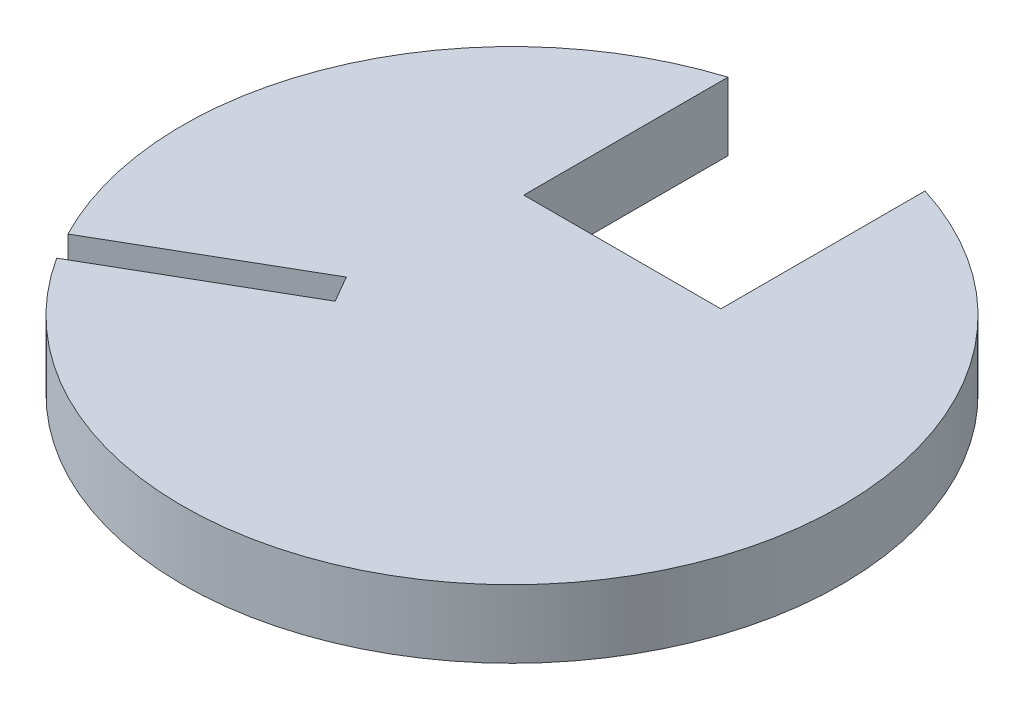
ISO-10303-21;
HEADER;
FILE_DESCRIPTION(('STEP AP214'),'2;1');
FILE_NAME('part.step','',(''),(''),'','','');
FILE_SCHEMA(('AUTOMOTIVE_DESIGN { 1 0 10303 214 1 1 1 1 }'));
ENDSEC;
DATA;
#1=APPLICATION_CONTEXT('core data for automotive mechanical design processes');
#2=APPLICATION_PROTOCOL_DEFINITION('international standard','automotive_design',2000,#1);
#3=PRODUCT_CONTEXT('',#1,'mechanical');
#4=PRODUCT('Part','Part','',(#3));
#5=PRODUCT_RELATED_PRODUCT_CATEGORY('part','',(#4));
#6=PRODUCT_DEFINITION_FORMATION('','',#4);
#7=PRODUCT_DEFINITION_CONTEXT('part definition',#1,'design');
#8=PRODUCT_DEFINITION('design','',#6,#7);
#9=PRODUCT_DEFINITION_SHAPE('','',#8);
#10=(LENGTH_UNIT() NAMED_UNIT(*) SI_UNIT(.MILLI.,.METRE.));
#11=(NAMED_UNIT(*) PLANE_ANGLE_UNIT() SI_UNIT($,.RADIAN.));
#12=(NAMED_UNIT(*) SI_UNIT($,.STERADIAN.) SOLID_ANGLE_UNIT());
#13=UNCERTAINTY_MEASURE_WITH_UNIT(LENGTH_MEASURE(1.E-05),#10,'distance_accuracy_value','');
#14=(GEOMETRIC_REPRESENTATION_CONTEXT(3) GLOBAL_UNCERTAINTY_ASSIGNED_CONTEXT((#13)) GLOBAL_UNIT_ASSIGNED_CONTEXT((#10,
#11,#12)) REPRESENTATION_CONTEXT('',''));
#15=CARTESIAN_POINT('',(0.,0.,0.));
#16=DIRECTION('',(0.,0.,1.));
#17=DIRECTION('',(1.,0.,0.));
#18=AXIS2_PLACEMENT_3D('',#15,#16,#17);
#19=CARTESIAN_POINT('',(0.,1.,3.35031229269065));
#20=DIRECTION('',(0.,-1.,0.));
#21=DIRECTION('',(0.,0.,-1.));
#22=AXIS2_PLACEMENT_3D('',#19,#20,#21);
#23=CYLINDRICAL_SURFACE('',#22,4.84174988325381);
#24=CARTESIAN_POINT('',(0.,1.,3.35031229269065));
#25=DIRECTION('',(0.,1.,0.));
#26=DIRECTION('',(0.,0.,1.));
#27=AXIS2_PLACEMENT_3D('',#24,#25,#26);
#28=CIRCLE('',#27,4.84174988325381);
#29=CARTESIAN_POINT('',(-4.07604839998194,1.,5.9634275547855));
#30=VERTEX_POINT('',#29);
#31=CARTESIAN_POINT('',(1.4475,1.,-1.27));
#32=VERTEX_POINT('',#31);
#33=EDGE_CURVE('E93',#30,#32,#28,.T.);
#34=ORIENTED_EDGE('',*,*,#33,.F.);
#35=DIRECTION('',(0.,-1.,0.));
#36=VECTOR('',#35,1.);
#37=CARTESIAN_POINT('',(-4.07604839998194,1.,5.9634275547855));
#38=LINE('',#37,#36);
#39=CARTESIAN_POINT('',(-4.07604839998194,0.,5.9634275547855));
#40=VERTEX_POINT('',#39);
#41=EDGE_CURVE('E118',#30,#40,#38,.T.);
#42=ORIENTED_EDGE('',*,*,#41,.T.);
#43=CARTESIAN_POINT('',(0.,0.,3.35031229269065));
#44=DIRECTION('',(0.,1.,0.));
#45=DIRECTION('',(0.,0.,1.));
#46=AXIS2_PLACEMENT_3D('',#43,#44,#45);
#47=CIRCLE('',#46,4.84174988325381);
#48=CARTESIAN_POINT('',(1.4475,0.,-1.27));
#49=VERTEX_POINT('',#48);
#50=EDGE_CURVE('E143',#40,#49,#47,.T.);
#51=ORIENTED_EDGE('',*,*,#50,.T.);
#52=DIRECTION('',(0.,-1.,0.));
#53=VECTOR('',#52,1.);
#54=CARTESIAN_POINT('',(1.4475,1.,-1.27));
#55=LINE('',#54,#53);
#56=EDGE_CURVE('E50',#32,#49,#55,.T.);
#57=ORIENTED_EDGE('',*,*,#56,.F.);
#58=EDGE_LOOP('',(#34,#42,#51,#57));
#59=FACE_BOUND('',#58,.T.);
#60=ADVANCED_FACE('F39',(#59),#23,.T.);
#61=CARTESIAN_POINT('',(-1.4475,0.,-1.27));
#62=VERTEX_POINT('',#61);
#63=CARTESIAN_POINT('',(-4.30104839998194,0.,5.5737161230825));
#64=VERTEX_POINT('',#63);
#65=EDGE_CURVE('E147',#62,#64,#47,.T.);
#66=ORIENTED_EDGE('',*,*,#65,.T.);
#67=DIRECTION('',(0.,-1.,0.));
#68=VECTOR('',#67,1.);
#69=CARTESIAN_POINT('',(-4.30104839998194,1.,5.5737161230825));
#70=LINE('',#69,#68);
#71=CARTESIAN_POINT('',(-4.30104839998194,1.,5.5737161230825));
#72=VERTEX_POINT('',#71);
#73=EDGE_CURVE('E140',#64,#72,#70,.F.);
#74=ORIENTED_EDGE('',*,*,#73,.T.);
#75=CARTESIAN_POINT('',(-1.4475,1.,-1.27));
#76=VERTEX_POINT('',#75);
#77=EDGE_CURVE('E142',#76,#72,#28,.T.);
#78=ORIENTED_EDGE('',*,*,#77,.F.);
#79=DIRECTION('',(0.,-1.,0.));
#80=VECTOR('',#79,1.);
#81=CARTESIAN_POINT('',(-1.4475,1.,-1.27));
#82=LINE('',#81,#80);
#83=EDGE_CURVE('E149',#76,#62,#82,.T.);
#84=ORIENTED_EDGE('',*,*,#83,.T.);
#85=EDGE_LOOP('',(#66,#74,#78,#84));
#86=FACE_BOUND('',#85,.T.);
#87=ADVANCED_FACE('F41',(#86),#23,.T.);
#88=CARTESIAN_POINT('',(1.4475,1.,1.73));
#89=DIRECTION('',(1.,0.,0.));
#90=DIRECTION('',(0.,0.,-1.));
#91=AXIS2_PLACEMENT_3D('',#88,#89,#90);
#92=PLANE('',#91);
#93=DIRECTION('',(0.,0.,1.));
#94=VECTOR('',#93,1.);
#95=CARTESIAN_POINT('',(1.4475,0.,1.73));
#96=LINE('',#95,#94);
#97=CARTESIAN_POINT('',(1.4475,0.,1.73));
#98=VERTEX_POINT('',#97);
#99=EDGE_CURVE('E153',#49,#98,#96,.T.);
#100=ORIENTED_EDGE('',*,*,#99,.T.);
#101=DIRECTION('',(0.,-1.,0.));
#102=VECTOR('',#101,1.);
#103=CARTESIAN_POINT('',(1.4475,1.,1.73));
#104=LINE('',#103,#102);
#105=CARTESIAN_POINT('',(1.4475,1.,1.73));
#106=VERTEX_POINT('',#105);
#107=EDGE_CURVE('E161',#106,#98,#104,.T.);
#108=ORIENTED_EDGE('',*,*,#107,.F.);
#109=DIRECTION('',(0.,0.,1.));
#110=VECTOR('',#109,1.);
#111=CARTESIAN_POINT('',(1.4475,1.,1.73));
#112=LINE('',#111,#110);
#113=EDGE_CURVE('E145',#32,#106,#112,.T.);
#114=ORIENTED_EDGE('',*,*,#113,.F.);
#115=ORIENTED_EDGE('',*,*,#56,.T.);
#116=EDGE_LOOP('',(#100,#108,#114,#115));
#117=FACE_BOUND('',#116,.T.);
#118=ADVANCED_FACE('F167',(#117),#92,.F.);
#119=CARTESIAN_POINT('',(-1.4475,1.,1.73));
#120=DIRECTION('',(0.,0.,1.));
#121=DIRECTION('',(1.,0.,0.));
#122=AXIS2_PLACEMENT_3D('',#119,#120,#121);
#123=PLANE('',#122);
#124=DIRECTION('',(-1.,0.,0.));
#125=VECTOR('',#124,1.);
#126=CARTESIAN_POINT('',(-1.4475,0.,1.73));
#127=LINE('',#126,#125);
#128=CARTESIAN_POINT('',(-1.4475,0.,1.73));
#129=VERTEX_POINT('',#128);
#130=EDGE_CURVE('E154',#98,#129,#127,.T.);
#131=ORIENTED_EDGE('',*,*,#130,.T.);
#132=DIRECTION('',(0.,-1.,0.));
#133=VECTOR('',#132,1.);
#134=CARTESIAN_POINT('',(-1.4475,1.,1.73));
#135=LINE('',#134,#133);
#136=CARTESIAN_POINT('',(-1.4475,1.,1.73));
#137=VERTEX_POINT('',#136);
#138=EDGE_CURVE('E157',#137,#129,#135,.T.);
#139=ORIENTED_EDGE('',*,*,#138,.F.);
#140=DIRECTION('',(-1.,0.,0.));
#141=VECTOR('',#140,1.);
#142=CARTESIAN_POINT('',(-1.4475,1.,1.73));
#143=LINE('',#142,#141);
#144=EDGE_CURVE('E148',#106,#137,#143,.T.);
#145=ORIENTED_EDGE('',*,*,#144,.F.);
#146=ORIENTED_EDGE('',*,*,#107,.T.);
#147=EDGE_LOOP('',(#131,#139,#145,#146));
#148=FACE_BOUND('',#147,.T.);
#149=ADVANCED_FACE('F180',(#148),#123,.F.);
#150=CARTESIAN_POINT('',(-1.4475,1.,1.73));
#151=DIRECTION('',(-1.,0.,0.));
#152=DIRECTION('',(0.,0.,1.));
#153=AXIS2_PLACEMENT_3D('',#150,#151,#152);
#154=PLANE('',#153);
#155=DIRECTION('',(0.,0.,-1.));
#156=VECTOR('',#155,1.);
#157=CARTESIAN_POINT('',(-1.4475,0.,1.73));
#158=LINE('',#157,#156);
#159=EDGE_CURVE('E82',#129,#62,#158,.T.);
#160=ORIENTED_EDGE('',*,*,#159,.T.);
#161=ORIENTED_EDGE('',*,*,#83,.F.);
#162=DIRECTION('',(0.,0.,-1.));
#163=VECTOR('',#162,1.);
#164=CARTESIAN_POINT('',(-1.4475,1.,1.73));
#165=LINE('',#164,#163);
#166=EDGE_CURVE('E65',#137,#76,#165,.T.);
#167=ORIENTED_EDGE('',*,*,#166,.F.);
#168=ORIENTED_EDGE('',*,*,#138,.T.);
#169=EDGE_LOOP('',(#160,#161,#167,#168));
#170=FACE_BOUND('',#169,.T.);
#171=ADVANCED_FACE('F177',(#170),#154,.F.);
#172=CARTESIAN_POINT('',(0.,1.,3.35031229269065));
#173=DIRECTION('',(0.,1.,0.));
#174=DIRECTION('',(0.,0.,1.));
#175=AXIS2_PLACEMENT_3D('',#172,#173,#174);
#176=PLANE('',#175);
#177=DIRECTION('',(0.866025403784439,0.,-0.5));
#178=VECTOR('',#177,1.);
#179=CARTESIAN_POINT('',(-4.08057839766815,1.,5.96604295016906));
#180=LINE('',#179,#178);
#181=CARTESIAN_POINT('',(-1.48250218631483,1.,4.46604295016906));
#182=VERTEX_POINT('',#181);
#183=EDGE_CURVE('E114',#30,#182,#180,.T.);
#184=ORIENTED_EDGE('',*,*,#183,.F.);
#185=ORIENTED_EDGE('',*,*,#33,.T.);
#186=ORIENTED_EDGE('',*,*,#113,.T.);
#187=ORIENTED_EDGE('',*,*,#144,.T.);
#188=ORIENTED_EDGE('',*,*,#166,.T.);
#189=ORIENTED_EDGE('',*,*,#77,.T.);
#190=DIRECTION('',(-0.866025403784439,0.,0.5));
#191=VECTOR('',#190,1.);
#192=CARTESIAN_POINT('',(-4.30557839766815,1.,5.57633151846606));
#193=LINE('',#192,#191);
#194=CARTESIAN_POINT('',(-1.70750218631483,1.,4.07633151846606));
#195=VERTEX_POINT('',#194);
#196=EDGE_CURVE('E130',#195,#72,#193,.T.);
#197=ORIENTED_EDGE('',*,*,#196,.F.);
#198=DIRECTION('',(-0.5,0.,-0.866025403784439));
#199=VECTOR('',#198,1.);
#200=CARTESIAN_POINT('',(-1.48250218631483,1.,4.46604295016906));
#201=LINE('',#200,#199);
#202=EDGE_CURVE('E121',#182,#195,#201,.T.);
#203=ORIENTED_EDGE('',*,*,#202,.F.);
#204=EDGE_LOOP('',(#184,#185,#186,#187,#188,#189,#197,#203));
#205=FACE_BOUND('',#204,.T.);
#206=ADVANCED_FACE('F129',(#205),#176,.T.);
#207=CARTESIAN_POINT('',(0.,0.,3.35031229269065));
#208=DIRECTION('',(0.,1.,0.));
#209=DIRECTION('',(0.,0.,1.));
#210=AXIS2_PLACEMENT_3D('',#207,#208,#209);
#211=PLANE('',#210);
#212=ORIENTED_EDGE('',*,*,#50,.F.);
#213=DIRECTION('',(-0.866025403784439,0.,0.5));
#214=VECTOR('',#213,1.);
#215=CARTESIAN_POINT('',(-4.08057839766815,0.,5.96604295016906));
#216=LINE('',#215,#214);
#217=CARTESIAN_POINT('',(-1.48250218631483,0.,4.46604295016906));
#218=VERTEX_POINT('',#217);
#219=EDGE_CURVE('E133',#218,#40,#216,.T.);
#220=ORIENTED_EDGE('',*,*,#219,.F.);
#221=DIRECTION('',(0.5,0.,0.866025403784439));
#222=VECTOR('',#221,1.);
#223=CARTESIAN_POINT('',(-1.48250218631483,0.,4.46604295016906));
#224=LINE('',#223,#222);
#225=CARTESIAN_POINT('',(-1.70750218631483,0.,4.07633151846606));
#226=VERTEX_POINT('',#225);
#227=EDGE_CURVE('E127',#226,#218,#224,.T.);
#228=ORIENTED_EDGE('',*,*,#227,.F.);
#229=DIRECTION('',(-0.866025403784439,0.,0.5));
#230=VECTOR('',#229,1.);
#231=CARTESIAN_POINT('',(-0.1125,0.,3.15545657683915));
#232=LINE('',#231,#230);
#233=EDGE_CURVE('E11',#226,#64,#232,.T.);
#234=ORIENTED_EDGE('',*,*,#233,.T.);
#235=ORIENTED_EDGE('',*,*,#65,.F.);
#236=ORIENTED_EDGE('',*,*,#159,.F.);
#237=ORIENTED_EDGE('',*,*,#130,.F.);
#238=ORIENTED_EDGE('',*,*,#99,.F.);
#239=EDGE_LOOP('',(#212,#220,#228,#234,#235,#236,#237,#238));
#240=FACE_BOUND('',#239,.T.);
#241=ADVANCED_FACE('F175',(#240),#211,.F.);
#242=CARTESIAN_POINT('',(-4.08057839766815,-3.39717067428441,5.96604295016906));
#243=DIRECTION('',(0.5,0.,0.866025403784439));
#244=DIRECTION('',(0.866025403784439,0.,-0.5));
#245=AXIS2_PLACEMENT_3D('',#242,#243,#244);
#246=PLANE('',#245);
#247=ORIENTED_EDGE('',*,*,#183,.T.);
#248=DIRECTION('',(0.,1.,0.));
#249=VECTOR('',#248,1.);
#250=CARTESIAN_POINT('',(-1.48250218631483,-3.39717067428441,4.46604295016906));
#251=LINE('',#250,#249);
#252=EDGE_CURVE('E119',#218,#182,#251,.T.);
#253=ORIENTED_EDGE('',*,*,#252,.F.);
#254=ORIENTED_EDGE('',*,*,#219,.T.);
#255=ORIENTED_EDGE('',*,*,#41,.F.);
#256=EDGE_LOOP('',(#247,#253,#254,#255));
#257=FACE_BOUND('',#256,.T.);
#258=ADVANCED_FACE('F113',(#257),#246,.F.);
#259=CARTESIAN_POINT('',(-4.30557839766815,-3.39717067428441,5.57633151846606));
#260=DIRECTION('',(-0.5,0.,-0.866025403784439));
#261=DIRECTION('',(-0.866025403784439,0.,0.5));
#262=AXIS2_PLACEMENT_3D('',#259,#260,#261);
#263=PLANE('',#262);
#264=ORIENTED_EDGE('',*,*,#233,.F.);
#265=DIRECTION('',(0.,1.,0.));
#266=VECTOR('',#265,1.);
#267=CARTESIAN_POINT('',(-1.70750218631483,-3.39717067428441,4.07633151846606));
#268=LINE('',#267,#266);
#269=EDGE_CURVE('E53',#226,#195,#268,.T.);
#270=ORIENTED_EDGE('',*,*,#269,.T.);
#271=ORIENTED_EDGE('',*,*,#196,.T.);
#272=ORIENTED_EDGE('',*,*,#73,.F.);
#273=EDGE_LOOP('',(#264,#270,#271,#272));
#274=FACE_BOUND('',#273,.T.);
#275=ADVANCED_FACE('F181',(#274),#263,.F.);
#276=CARTESIAN_POINT('',(-1.48250218631483,-3.39717067428441,4.46604295016906));
#277=DIRECTION('',(0.866025403784438,0.,-0.5));
#278=DIRECTION('',(-0.5,0.,-0.866025403784439));
#279=AXIS2_PLACEMENT_3D('',#276,#277,#278);
#280=PLANE('',#279);
#281=ORIENTED_EDGE('',*,*,#227,.T.);
#282=ORIENTED_EDGE('',*,*,#252,.T.);
#283=ORIENTED_EDGE('',*,*,#202,.T.);
#284=ORIENTED_EDGE('',*,*,#269,.F.);
#285=EDGE_LOOP('',(#281,#282,#283,#284));
#286=FACE_BOUND('',#285,.T.);
#287=ADVANCED_FACE('F123',(#286),#280,.F.);
#288=CLOSED_SHELL('',(#60,#87,#118,#149,#171,#206,#241,#258,#275,#287));
#289=MANIFOLD_SOLID_BREP('B2',#288);
#290=ADVANCED_BREP_SHAPE_REPRESENTATION('',(#18,#289),#14);
#291=SHAPE_DEFINITION_REPRESENTATION(#9,#290);
ENDSEC;
END-ISO-10303-21;
